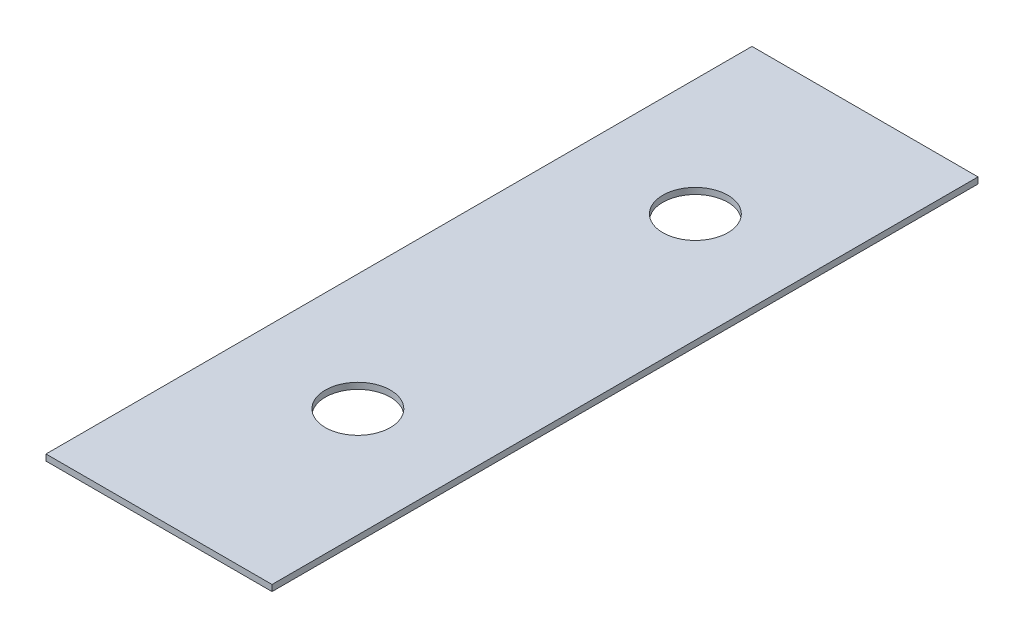
ISO-10303-21;
HEADER;
FILE_DESCRIPTION(('STEP AP214'),'2;1');
FILE_NAME('part.step','',(''),(''),'','','');
FILE_SCHEMA(('AUTOMOTIVE_DESIGN { 1 0 10303 214 1 1 1 1 }'));
ENDSEC;
DATA;
#1=APPLICATION_CONTEXT('core data for automotive mechanical design processes');
#2=APPLICATION_PROTOCOL_DEFINITION('international standard','automotive_design',2000,#1);
#3=PRODUCT_CONTEXT('',#1,'mechanical');
#4=PRODUCT('Part','Part','',(#3));
#5=PRODUCT_RELATED_PRODUCT_CATEGORY('part','',(#4));
#6=PRODUCT_DEFINITION_FORMATION('','',#4);
#7=PRODUCT_DEFINITION_CONTEXT('part definition',#1,'design');
#8=PRODUCT_DEFINITION('design','',#6,#7);
#9=PRODUCT_DEFINITION_SHAPE('','',#8);
#10=(LENGTH_UNIT() NAMED_UNIT(*) SI_UNIT(.MILLI.,.METRE.));
#11=(NAMED_UNIT(*) PLANE_ANGLE_UNIT() SI_UNIT($,.RADIAN.));
#12=(NAMED_UNIT(*) SI_UNIT($,.STERADIAN.) SOLID_ANGLE_UNIT());
#13=UNCERTAINTY_MEASURE_WITH_UNIT(LENGTH_MEASURE(1.E-05),#10,'distance_accuracy_value','');
#14=(GEOMETRIC_REPRESENTATION_CONTEXT(3) GLOBAL_UNCERTAINTY_ASSIGNED_CONTEXT((#13)) GLOBAL_UNIT_ASSIGNED_CONTEXT((#10,
#11,#12)) REPRESENTATION_CONTEXT('',''));
#15=CARTESIAN_POINT('',(0.,0.,0.));
#16=DIRECTION('',(0.,0.,1.));
#17=DIRECTION('',(1.,0.,0.));
#18=AXIS2_PLACEMENT_3D('',#15,#16,#17);
#19=CARTESIAN_POINT('',(0.,2.,0.));
#20=DIRECTION('',(-1.,0.,0.));
#21=DIRECTION('',(0.,0.,1.));
#22=AXIS2_PLACEMENT_3D('',#19,#20,#21);
#23=PLANE('',#22);
#24=DIRECTION('',(0.,0.,-1.));
#25=VECTOR('',#24,1.);
#26=CARTESIAN_POINT('',(0.,0.,0.));
#27=LINE('',#26,#25);
#28=CARTESIAN_POINT('',(0.,0.,228.));
#29=VERTEX_POINT('',#28);
#30=CARTESIAN_POINT('',(0.,0.,0.));
#31=VERTEX_POINT('',#30);
#32=EDGE_CURVE('E109',#29,#31,#27,.T.);
#33=ORIENTED_EDGE('',*,*,#32,.T.);
#34=DIRECTION('',(0.,-1.,0.));
#35=VECTOR('',#34,1.);
#36=CARTESIAN_POINT('',(0.,2.,0.));
#37=LINE('',#36,#35);
#38=CARTESIAN_POINT('',(0.,2.,0.));
#39=VERTEX_POINT('',#38);
#40=EDGE_CURVE('E11',#39,#31,#37,.T.);
#41=ORIENTED_EDGE('',*,*,#40,.F.);
#42=DIRECTION('',(0.,0.,-1.));
#43=VECTOR('',#42,1.);
#44=CARTESIAN_POINT('',(0.,2.,0.));
#45=LINE('',#44,#43);
#46=CARTESIAN_POINT('',(0.,2.,228.));
#47=VERTEX_POINT('',#46);
#48=EDGE_CURVE('E93',#47,#39,#45,.T.);
#49=ORIENTED_EDGE('',*,*,#48,.F.);
#50=DIRECTION('',(0.,-1.,0.));
#51=VECTOR('',#50,1.);
#52=CARTESIAN_POINT('',(0.,2.,228.));
#53=LINE('',#52,#51);
#54=EDGE_CURVE('E105',#47,#29,#53,.T.);
#55=ORIENTED_EDGE('',*,*,#54,.T.);
#56=EDGE_LOOP('',(#33,#41,#49,#55));
#57=FACE_BOUND('',#56,.T.);
#58=ADVANCED_FACE('F41',(#57),#23,.F.);
#59=CARTESIAN_POINT('',(0.,2.,0.));
#60=DIRECTION('',(0.,0.,1.));
#61=DIRECTION('',(1.,0.,0.));
#62=AXIS2_PLACEMENT_3D('',#59,#60,#61);
#63=PLANE('',#62);
#64=DIRECTION('',(-1.,0.,0.));
#65=VECTOR('',#64,1.);
#66=CARTESIAN_POINT('',(0.,0.,0.));
#67=LINE('',#66,#65);
#68=CARTESIAN_POINT('',(-73.,0.,0.));
#69=VERTEX_POINT('',#68);
#70=EDGE_CURVE('E98',#31,#69,#67,.T.);
#71=ORIENTED_EDGE('',*,*,#70,.T.);
#72=DIRECTION('',(0.,-1.,0.));
#73=VECTOR('',#72,1.);
#74=CARTESIAN_POINT('',(-73.,2.,0.));
#75=LINE('',#74,#73);
#76=CARTESIAN_POINT('',(-73.,2.,0.));
#77=VERTEX_POINT('',#76);
#78=EDGE_CURVE('E50',#77,#69,#75,.T.);
#79=ORIENTED_EDGE('',*,*,#78,.F.);
#80=DIRECTION('',(-1.,0.,0.));
#81=VECTOR('',#80,1.);
#82=CARTESIAN_POINT('',(0.,2.,0.));
#83=LINE('',#82,#81);
#84=EDGE_CURVE('E88',#39,#77,#83,.T.);
#85=ORIENTED_EDGE('',*,*,#84,.F.);
#86=ORIENTED_EDGE('',*,*,#40,.T.);
#87=EDGE_LOOP('',(#71,#79,#85,#86));
#88=FACE_BOUND('',#87,.T.);
#89=ADVANCED_FACE('F97',(#88),#63,.F.);
#90=CARTESIAN_POINT('',(-73.,2.,0.));
#91=DIRECTION('',(1.,0.,0.));
#92=DIRECTION('',(0.,0.,-1.));
#93=AXIS2_PLACEMENT_3D('',#90,#91,#92);
#94=PLANE('',#93);
#95=DIRECTION('',(0.,0.,1.));
#96=VECTOR('',#95,1.);
#97=CARTESIAN_POINT('',(-73.,0.,0.));
#98=LINE('',#97,#96);
#99=CARTESIAN_POINT('',(-73.,0.,228.));
#100=VERTEX_POINT('',#99);
#101=EDGE_CURVE('E75',#69,#100,#98,.T.);
#102=ORIENTED_EDGE('',*,*,#101,.T.);
#103=DIRECTION('',(0.,-1.,0.));
#104=VECTOR('',#103,1.);
#105=CARTESIAN_POINT('',(-73.,2.,228.));
#106=LINE('',#105,#104);
#107=CARTESIAN_POINT('',(-73.,2.,228.));
#108=VERTEX_POINT('',#107);
#109=EDGE_CURVE('E100',#108,#100,#106,.T.);
#110=ORIENTED_EDGE('',*,*,#109,.F.);
#111=DIRECTION('',(0.,0.,1.));
#112=VECTOR('',#111,1.);
#113=CARTESIAN_POINT('',(-73.,2.,0.));
#114=LINE('',#113,#112);
#115=EDGE_CURVE('E91',#77,#108,#114,.T.);
#116=ORIENTED_EDGE('',*,*,#115,.F.);
#117=ORIENTED_EDGE('',*,*,#78,.T.);
#118=EDGE_LOOP('',(#102,#110,#116,#117));
#119=FACE_BOUND('',#118,.T.);
#120=ADVANCED_FACE('F101',(#119),#94,.F.);
#121=CARTESIAN_POINT('',(0.,2.,228.));
#122=DIRECTION('',(0.,0.,-1.));
#123=DIRECTION('',(-1.,0.,0.));
#124=AXIS2_PLACEMENT_3D('',#121,#122,#123);
#125=PLANE('',#124);
#126=DIRECTION('',(1.,0.,0.));
#127=VECTOR('',#126,1.);
#128=CARTESIAN_POINT('',(0.,0.,228.));
#129=LINE('',#128,#127);
#130=EDGE_CURVE('E81',#100,#29,#129,.T.);
#131=ORIENTED_EDGE('',*,*,#130,.T.);
#132=ORIENTED_EDGE('',*,*,#54,.F.);
#133=DIRECTION('',(1.,0.,0.));
#134=VECTOR('',#133,1.);
#135=CARTESIAN_POINT('',(0.,2.,228.));
#136=LINE('',#135,#134);
#137=EDGE_CURVE('E58',#108,#47,#136,.T.);
#138=ORIENTED_EDGE('',*,*,#137,.F.);
#139=ORIENTED_EDGE('',*,*,#109,.T.);
#140=EDGE_LOOP('',(#131,#132,#138,#139));
#141=FACE_BOUND('',#140,.T.);
#142=ADVANCED_FACE('F123',(#141),#125,.F.);
#143=CARTESIAN_POINT('',(0.,2.,0.));
#144=DIRECTION('',(0.,-1.,0.));
#145=DIRECTION('',(0.,0.,-1.));
#146=AXIS2_PLACEMENT_3D('',#143,#144,#145);
#147=PLANE('',#146);
#148=CARTESIAN_POINT('',(-35.2792497556115,2.,56.));
#149=DIRECTION('',(0.,1.,0.));
#150=DIRECTION('',(0.,0.,1.));
#151=AXIS2_PLACEMENT_3D('',#148,#149,#150);
#152=CIRCLE('',#151,10.5);
#153=CARTESIAN_POINT('',(-35.2792497556115,2.,66.5));
#154=VERTEX_POINT('',#153);
#155=EDGE_CURVE('E138',#154,#154,#152,.T.);
#156=ORIENTED_EDGE('',*,*,#155,.F.);
#157=EDGE_LOOP('',(#156));
#158=FACE_BOUND('',#157,.T.);
#159=CARTESIAN_POINT('',(-35.2792497556115,2.,165.));
#160=DIRECTION('',(0.,1.,0.));
#161=DIRECTION('',(0.,0.,1.));
#162=AXIS2_PLACEMENT_3D('',#159,#160,#161);
#163=CIRCLE('',#162,10.5);
#164=CARTESIAN_POINT('',(-35.2792497556115,2.,175.5));
#165=VERTEX_POINT('',#164);
#166=EDGE_CURVE('E130',#165,#165,#163,.T.);
#167=ORIENTED_EDGE('',*,*,#166,.F.);
#168=EDGE_LOOP('',(#167));
#169=FACE_BOUND('',#168,.T.);
#170=ORIENTED_EDGE('',*,*,#48,.T.);
#171=ORIENTED_EDGE('',*,*,#84,.T.);
#172=ORIENTED_EDGE('',*,*,#115,.T.);
#173=ORIENTED_EDGE('',*,*,#137,.T.);
#174=EDGE_LOOP('',(#170,#171,#172,#173));
#175=FACE_BOUND('',#174,.T.);
#176=ADVANCED_FACE('F89',(#158,#169,#175),#147,.F.);
#177=CARTESIAN_POINT('',(0.,0.,0.));
#178=DIRECTION('',(0.,-1.,0.));
#179=DIRECTION('',(0.,0.,-1.));
#180=AXIS2_PLACEMENT_3D('',#177,#178,#179);
#181=PLANE('',#180);
#182=CARTESIAN_POINT('',(-35.2792497556115,0.,56.));
#183=DIRECTION('',(0.,1.,0.));
#184=DIRECTION('',(0.,0.,1.));
#185=AXIS2_PLACEMENT_3D('',#182,#183,#184);
#186=CIRCLE('',#185,10.5);
#187=CARTESIAN_POINT('',(-35.2792497556115,0.,66.5));
#188=VERTEX_POINT('',#187);
#189=EDGE_CURVE('E113',#188,#188,#186,.T.);
#190=ORIENTED_EDGE('',*,*,#189,.T.);
#191=EDGE_LOOP('',(#190));
#192=FACE_BOUND('',#191,.T.);
#193=CARTESIAN_POINT('',(-35.2792497556115,0.,165.));
#194=DIRECTION('',(0.,1.,0.));
#195=DIRECTION('',(0.,0.,1.));
#196=AXIS2_PLACEMENT_3D('',#193,#194,#195);
#197=CIRCLE('',#196,10.5);
#198=CARTESIAN_POINT('',(-35.2792497556115,0.,175.5));
#199=VERTEX_POINT('',#198);
#200=EDGE_CURVE('E134',#199,#199,#197,.T.);
#201=ORIENTED_EDGE('',*,*,#200,.T.);
#202=EDGE_LOOP('',(#201));
#203=FACE_BOUND('',#202,.T.);
#204=ORIENTED_EDGE('',*,*,#32,.F.);
#205=ORIENTED_EDGE('',*,*,#130,.F.);
#206=ORIENTED_EDGE('',*,*,#101,.F.);
#207=ORIENTED_EDGE('',*,*,#70,.F.);
#208=EDGE_LOOP('',(#204,#205,#206,#207));
#209=FACE_BOUND('',#208,.T.);
#210=ADVANCED_FACE('F126',(#192,#203,#209),#181,.T.);
#211=CARTESIAN_POINT('',(-35.2792497556115,0.,165.));
#212=DIRECTION('',(0.,1.,0.));
#213=DIRECTION('',(0.,0.,1.));
#214=AXIS2_PLACEMENT_3D('',#211,#212,#213);
#215=CYLINDRICAL_SURFACE('',#214,10.5);
#216=ORIENTED_EDGE('',*,*,#200,.F.);
#217=EDGE_LOOP('',(#216));
#218=FACE_BOUND('',#217,.T.);
#219=ORIENTED_EDGE('',*,*,#166,.T.);
#220=EDGE_LOOP('',(#219));
#221=FACE_BOUND('',#220,.T.);
#222=ADVANCED_FACE('F151',(#218,#221),#215,.F.);
#223=CARTESIAN_POINT('',(-35.2792497556115,0.,56.));
#224=DIRECTION('',(0.,1.,0.));
#225=DIRECTION('',(0.,0.,1.));
#226=AXIS2_PLACEMENT_3D('',#223,#224,#225);
#227=CYLINDRICAL_SURFACE('',#226,10.5);
#228=ORIENTED_EDGE('',*,*,#189,.F.);
#229=EDGE_LOOP('',(#228));
#230=FACE_BOUND('',#229,.T.);
#231=ORIENTED_EDGE('',*,*,#155,.T.);
#232=EDGE_LOOP('',(#231));
#233=FACE_BOUND('',#232,.T.);
#234=ADVANCED_FACE('F148',(#230,#233),#227,.F.);
#235=CLOSED_SHELL('',(#58,#89,#120,#142,#176,#210,#222,#234));
#236=MANIFOLD_SOLID_BREP('B2',#235);
#237=ADVANCED_BREP_SHAPE_REPRESENTATION('',(#18,#236),#14);
#238=SHAPE_DEFINITION_REPRESENTATION(#9,#237);
ENDSEC;
END-ISO-10303-21;
